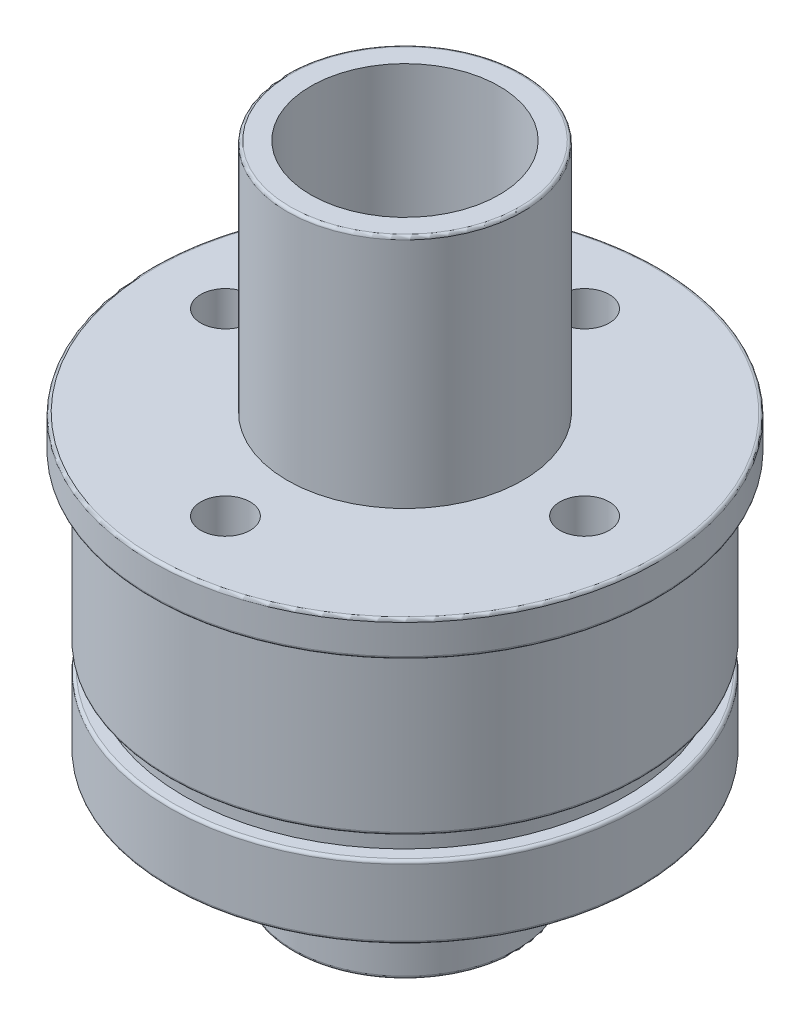
ISO-10303-21;
HEADER;
FILE_DESCRIPTION(('STEP AP214'),'2;1');
FILE_NAME('part.step','',(''),(''),'','','');
FILE_SCHEMA(('AUTOMOTIVE_DESIGN { 1 0 10303 214 1 1 1 1 }'));
ENDSEC;
DATA;
#1=APPLICATION_CONTEXT('core data for automotive mechanical design processes');
#2=APPLICATION_PROTOCOL_DEFINITION('international standard','automotive_design',2000,#1);
#3=PRODUCT_CONTEXT('',#1,'mechanical');
#4=PRODUCT('Part','Part','',(#3));
#5=PRODUCT_RELATED_PRODUCT_CATEGORY('part','',(#4));
#6=PRODUCT_DEFINITION_FORMATION('','',#4);
#7=PRODUCT_DEFINITION_CONTEXT('part definition',#1,'design');
#8=PRODUCT_DEFINITION('design','',#6,#7);
#9=PRODUCT_DEFINITION_SHAPE('','',#8);
#10=(LENGTH_UNIT() NAMED_UNIT(*) SI_UNIT(.MILLI.,.METRE.));
#11=(NAMED_UNIT(*) PLANE_ANGLE_UNIT() SI_UNIT($,.RADIAN.));
#12=(NAMED_UNIT(*) SI_UNIT($,.STERADIAN.) SOLID_ANGLE_UNIT());
#13=UNCERTAINTY_MEASURE_WITH_UNIT(LENGTH_MEASURE(1.E-05),#10,'distance_accuracy_value','');
#14=(GEOMETRIC_REPRESENTATION_CONTEXT(3) GLOBAL_UNCERTAINTY_ASSIGNED_CONTEXT((#13)) GLOBAL_UNIT_ASSIGNED_CONTEXT((#10,
#11,#12)) REPRESENTATION_CONTEXT('',''));
#15=CARTESIAN_POINT('',(0.,0.,0.));
#16=DIRECTION('',(0.,0.,1.));
#17=DIRECTION('',(1.,0.,0.));
#18=AXIS2_PLACEMENT_3D('',#15,#16,#17);
#19=CARTESIAN_POINT('',(0.,29.,0.));
#20=DIRECTION('',(0.,1.,0.));
#21=DIRECTION('',(0.,0.,1.));
#22=AXIS2_PLACEMENT_3D('',#19,#20,#21);
#23=CYLINDRICAL_SURFACE('',#22,20.);
#24=CARTESIAN_POINT('',(0.,32.25,0.));
#25=DIRECTION('',(0.,-1.,0.));
#26=DIRECTION('',(0.,0.,-1.));
#27=AXIS2_PLACEMENT_3D('',#24,#25,#26);
#28=CIRCLE('',#27,20.);
#29=CARTESIAN_POINT('',(0.,32.25,-20.));
#30=VERTEX_POINT('',#29);
#31=EDGE_CURVE('E201',#30,#30,#28,.F.);
#32=ORIENTED_EDGE('',*,*,#31,.T.);
#33=EDGE_LOOP('',(#32));
#34=FACE_BOUND('',#33,.T.);
#35=CARTESIAN_POINT('',(0.,46.00000000001,0.));
#36=DIRECTION('',(0.,-1.,0.));
#37=DIRECTION('',(0.,0.,-1.));
#38=AXIS2_PLACEMENT_3D('',#35,#36,#37);
#39=CIRCLE('',#38,20.);
#40=CARTESIAN_POINT('',(0.,46.00000000001,-20.));
#41=VERTEX_POINT('',#40);
#42=EDGE_CURVE('E162',#41,#41,#39,.T.);
#43=ORIENTED_EDGE('',*,*,#42,.T.);
#44=EDGE_LOOP('',(#43));
#45=FACE_BOUND('',#44,.T.);
#46=ADVANCED_FACE('F49',(#34,#45),#23,.T.);
#47=CARTESIAN_POINT('',(0.,49.,0.));
#48=DIRECTION('',(0.,-1.,0.));
#49=DIRECTION('',(0.,0.,-1.));
#50=AXIS2_PLACEMENT_3D('',#47,#48,#49);
#51=CYLINDRICAL_SURFACE('',#50,21.5);
#52=CARTESIAN_POINT('',(0.,46.25000000001,0.));
#53=DIRECTION('',(0.,-1.,0.));
#54=DIRECTION('',(0.,0.,-1.));
#55=AXIS2_PLACEMENT_3D('',#52,#53,#54);
#56=CIRCLE('',#55,21.5);
#57=CARTESIAN_POINT('',(0.,46.25000000001,-21.5));
#58=VERTEX_POINT('',#57);
#59=EDGE_CURVE('E180',#58,#58,#56,.F.);
#60=ORIENTED_EDGE('',*,*,#59,.T.);
#61=EDGE_LOOP('',(#60));
#62=FACE_BOUND('',#61,.T.);
#63=CARTESIAN_POINT('',(0.,48.75,0.));
#64=DIRECTION('',(0.,1.,0.));
#65=DIRECTION('',(0.,0.,1.));
#66=AXIS2_PLACEMENT_3D('',#63,#64,#65);
#67=CIRCLE('',#66,21.5);
#68=CARTESIAN_POINT('',(0.,48.75,21.5));
#69=VERTEX_POINT('',#68);
#70=EDGE_CURVE('E177',#69,#69,#67,.F.);
#71=ORIENTED_EDGE('',*,*,#70,.T.);
#72=EDGE_LOOP('',(#71));
#73=FACE_BOUND('',#72,.T.);
#74=ADVANCED_FACE('F224',(#62,#73),#51,.T.);
#75=CARTESIAN_POINT('',(21.5,49.,0.));
#76=DIRECTION('',(0.,1.,0.));
#77=DIRECTION('',(0.,0.,1.));
#78=AXIS2_PLACEMENT_3D('',#75,#76,#77);
#79=PLANE('',#78);
#80=CARTESIAN_POINT('',(0.,49.,-15.25));
#81=DIRECTION('',(0.,1.,0.));
#82=DIRECTION('',(0.,0.,1.));
#83=AXIS2_PLACEMENT_3D('',#80,#81,#82);
#84=CIRCLE('',#83,2.1);
#85=CARTESIAN_POINT('',(0.,49.,-13.15));
#86=VERTEX_POINT('',#85);
#87=EDGE_CURVE('E93',#86,#86,#84,.T.);
#88=ORIENTED_EDGE('',*,*,#87,.F.);
#89=EDGE_LOOP('',(#88));
#90=FACE_BOUND('',#89,.T.);
#91=CARTESIAN_POINT('',(15.25,49.,0.));
#92=DIRECTION('',(0.,1.,0.));
#93=DIRECTION('',(0.,0.,1.));
#94=AXIS2_PLACEMENT_3D('',#91,#92,#93);
#95=CIRCLE('',#94,2.1);
#96=CARTESIAN_POINT('',(15.25,49.,2.1));
#97=VERTEX_POINT('',#96);
#98=EDGE_CURVE('E92',#97,#97,#95,.T.);
#99=ORIENTED_EDGE('',*,*,#98,.F.);
#100=EDGE_LOOP('',(#99));
#101=FACE_BOUND('',#100,.T.);
#102=CARTESIAN_POINT('',(0.,49.,15.25));
#103=DIRECTION('',(0.,1.,0.));
#104=DIRECTION('',(0.,0.,1.));
#105=AXIS2_PLACEMENT_3D('',#102,#103,#104);
#106=CIRCLE('',#105,2.1);
#107=CARTESIAN_POINT('',(0.,49.,17.35));
#108=VERTEX_POINT('',#107);
#109=EDGE_CURVE('E105',#108,#108,#106,.T.);
#110=ORIENTED_EDGE('',*,*,#109,.F.);
#111=EDGE_LOOP('',(#110));
#112=FACE_BOUND('',#111,.T.);
#113=CARTESIAN_POINT('',(-15.25,49.,0.));
#114=DIRECTION('',(0.,1.,0.));
#115=DIRECTION('',(0.,0.,1.));
#116=AXIS2_PLACEMENT_3D('',#113,#114,#115);
#117=CIRCLE('',#116,2.1);
#118=CARTESIAN_POINT('',(-15.25,49.,2.1));
#119=VERTEX_POINT('',#118);
#120=EDGE_CURVE('E111',#119,#119,#117,.T.);
#121=ORIENTED_EDGE('',*,*,#120,.F.);
#122=EDGE_LOOP('',(#121));
#123=FACE_BOUND('',#122,.T.);
#124=CARTESIAN_POINT('',(0.,49.,0.));
#125=DIRECTION('',(0.,1.,0.));
#126=DIRECTION('',(0.,0.,1.));
#127=AXIS2_PLACEMENT_3D('',#124,#125,#126);
#128=CIRCLE('',#127,21.25);
#129=CARTESIAN_POINT('',(0.,49.,21.25));
#130=VERTEX_POINT('',#129);
#131=EDGE_CURVE('E183',#130,#130,#128,.T.);
#132=ORIENTED_EDGE('',*,*,#131,.T.);
#133=EDGE_LOOP('',(#132));
#134=FACE_BOUND('',#133,.T.);
#135=CARTESIAN_POINT('',(0.,49.,0.));
#136=DIRECTION('',(0.,1.,0.));
#137=DIRECTION('',(0.,0.,1.));
#138=AXIS2_PLACEMENT_3D('',#135,#136,#137);
#139=CIRCLE('',#138,10.);
#140=CARTESIAN_POINT('',(0.,49.,10.));
#141=VERTEX_POINT('',#140);
#142=EDGE_CURVE('E163',#141,#141,#139,.T.);
#143=ORIENTED_EDGE('',*,*,#142,.F.);
#144=EDGE_LOOP('',(#143));
#145=FACE_BOUND('',#144,.T.);
#146=ADVANCED_FACE('F232',(#90,#101,#112,#123,#134,#145),#79,.T.);
#147=CARTESIAN_POINT('',(0.,46.00000000001,0.));
#148=DIRECTION('',(0.,-1.,0.));
#149=DIRECTION('',(0.,0.,-1.));
#150=AXIS2_PLACEMENT_3D('',#147,#148,#149);
#151=PLANE('',#150);
#152=CARTESIAN_POINT('',(0.,46.00000000001,0.));
#153=DIRECTION('',(0.,-1.,0.));
#154=DIRECTION('',(0.,0.,-1.));
#155=AXIS2_PLACEMENT_3D('',#152,#153,#154);
#156=CIRCLE('',#155,21.25);
#157=CARTESIAN_POINT('',(0.,46.00000000001,-21.25));
#158=VERTEX_POINT('',#157);
#159=EDGE_CURVE('E174',#158,#158,#156,.T.);
#160=ORIENTED_EDGE('',*,*,#159,.T.);
#161=EDGE_LOOP('',(#160));
#162=FACE_BOUND('',#161,.T.);
#163=ORIENTED_EDGE('',*,*,#42,.F.);
#164=EDGE_LOOP('',(#163));
#165=FACE_BOUND('',#164,.T.);
#166=ADVANCED_FACE('F291',(#162,#165),#151,.T.);
#167=CARTESIAN_POINT('',(0.,69.,0.));
#168=DIRECTION('',(0.,-1.,0.));
#169=DIRECTION('',(0.,0.,-1.));
#170=AXIS2_PLACEMENT_3D('',#167,#168,#169);
#171=CYLINDRICAL_SURFACE('',#170,10.);
#172=CARTESIAN_POINT('',(0.,68.75,0.));
#173=DIRECTION('',(0.,1.,0.));
#174=DIRECTION('',(0.,0.,1.));
#175=AXIS2_PLACEMENT_3D('',#172,#173,#174);
#176=CIRCLE('',#175,10.);
#177=CARTESIAN_POINT('',(0.,68.75,10.));
#178=VERTEX_POINT('',#177);
#179=EDGE_CURVE('E189',#178,#178,#176,.F.);
#180=ORIENTED_EDGE('',*,*,#179,.T.);
#181=EDGE_LOOP('',(#180));
#182=FACE_BOUND('',#181,.T.);
#183=ORIENTED_EDGE('',*,*,#142,.T.);
#184=EDGE_LOOP('',(#183));
#185=FACE_BOUND('',#184,.T.);
#186=ADVANCED_FACE('F284',(#182,#185),#171,.T.);
#187=CARTESIAN_POINT('',(0.,69.,0.));
#188=DIRECTION('',(0.,1.,0.));
#189=DIRECTION('',(0.,0.,1.));
#190=AXIS2_PLACEMENT_3D('',#187,#188,#189);
#191=PLANE('',#190);
#192=CARTESIAN_POINT('',(0.,69.,0.));
#193=DIRECTION('',(0.,1.,0.));
#194=DIRECTION('',(0.,0.,1.));
#195=AXIS2_PLACEMENT_3D('',#192,#193,#194);
#196=CIRCLE('',#195,8.);
#197=CARTESIAN_POINT('',(0.,69.,8.));
#198=VERTEX_POINT('',#197);
#199=EDGE_CURVE('E99',#198,#198,#196,.T.);
#200=ORIENTED_EDGE('',*,*,#199,.F.);
#201=EDGE_LOOP('',(#200));
#202=FACE_BOUND('',#201,.T.);
#203=CARTESIAN_POINT('',(0.,69.,0.));
#204=DIRECTION('',(0.,1.,0.));
#205=DIRECTION('',(0.,0.,1.));
#206=AXIS2_PLACEMENT_3D('',#203,#204,#205);
#207=CIRCLE('',#206,9.75);
#208=CARTESIAN_POINT('',(0.,69.,9.75));
#209=VERTEX_POINT('',#208);
#210=EDGE_CURVE('E186',#209,#209,#207,.T.);
#211=ORIENTED_EDGE('',*,*,#210,.T.);
#212=EDGE_LOOP('',(#211));
#213=FACE_BOUND('',#212,.T.);
#214=ADVANCED_FACE('F265',(#202,#213),#191,.T.);
#215=CARTESIAN_POINT('',(0.,46.25000000001,0.));
#216=DIRECTION('',(0.,-1.,0.));
#217=DIRECTION('',(0.,0.,-1.));
#218=AXIS2_PLACEMENT_3D('',#215,#216,#217);
#219=TOROIDAL_SURFACE('',#218,21.25,0.25);
#220=ORIENTED_EDGE('',*,*,#59,.F.);
#221=EDGE_LOOP('',(#220));
#222=FACE_BOUND('',#221,.T.);
#223=ORIENTED_EDGE('',*,*,#159,.F.);
#224=EDGE_LOOP('',(#223));
#225=FACE_BOUND('',#224,.T.);
#226=ADVANCED_FACE('F262',(#222,#225),#219,.T.);
#227=CARTESIAN_POINT('',(0.,48.75,0.));
#228=DIRECTION('',(0.,1.,0.));
#229=DIRECTION('',(0.,0.,1.));
#230=AXIS2_PLACEMENT_3D('',#227,#228,#229);
#231=TOROIDAL_SURFACE('',#230,21.25,0.25);
#232=ORIENTED_EDGE('',*,*,#131,.F.);
#233=EDGE_LOOP('',(#232));
#234=FACE_BOUND('',#233,.T.);
#235=ORIENTED_EDGE('',*,*,#70,.F.);
#236=EDGE_LOOP('',(#235));
#237=FACE_BOUND('',#236,.T.);
#238=ADVANCED_FACE('F264',(#234,#237),#231,.T.);
#239=CARTESIAN_POINT('',(0.,68.75,0.));
#240=DIRECTION('',(0.,1.,0.));
#241=DIRECTION('',(0.,0.,1.));
#242=AXIS2_PLACEMENT_3D('',#239,#240,#241);
#243=TOROIDAL_SURFACE('',#242,9.75,0.25);
#244=ORIENTED_EDGE('',*,*,#179,.F.);
#245=EDGE_LOOP('',(#244));
#246=FACE_BOUND('',#245,.T.);
#247=ORIENTED_EDGE('',*,*,#210,.F.);
#248=EDGE_LOOP('',(#247));
#249=FACE_BOUND('',#248,.T.);
#250=ADVANCED_FACE('F269',(#246,#249),#243,.T.);
#251=CARTESIAN_POINT('',(0.,30.15,0.));
#252=DIRECTION('',(0.,-1.,0.));
#253=DIRECTION('',(0.,0.,-1.));
#254=AXIS2_PLACEMENT_3D('',#251,#252,#253);
#255=PLANE('',#254);
#256=CARTESIAN_POINT('',(0.,30.15,0.));
#257=DIRECTION('',(0.,-1.,0.));
#258=DIRECTION('',(0.,0.,-1.));
#259=AXIS2_PLACEMENT_3D('',#256,#257,#258);
#260=CIRCLE('',#259,19.75);
#261=CARTESIAN_POINT('',(0.,30.15,-19.75));
#262=VERTEX_POINT('',#261);
#263=EDGE_CURVE('E12',#262,#262,#260,.F.);
#264=ORIENTED_EDGE('',*,*,#263,.T.);
#265=EDGE_LOOP('',(#264));
#266=FACE_BOUND('',#265,.T.);
#267=CARTESIAN_POINT('',(0.,30.15,0.));
#268=DIRECTION('',(0.,-1.,0.));
#269=DIRECTION('',(0.,0.,-1.));
#270=AXIS2_PLACEMENT_3D('',#267,#268,#269);
#271=CIRCLE('',#270,18.75);
#272=CARTESIAN_POINT('',(0.,30.15,-18.75));
#273=VERTEX_POINT('',#272);
#274=EDGE_CURVE('E154',#273,#273,#271,.T.);
#275=ORIENTED_EDGE('',*,*,#274,.T.);
#276=EDGE_LOOP('',(#275));
#277=FACE_BOUND('',#276,.T.);
#278=ADVANCED_FACE('F272',(#266,#277),#255,.F.);
#279=CARTESIAN_POINT('',(0.,32.,0.));
#280=DIRECTION('',(0.,-1.,0.));
#281=DIRECTION('',(0.,0.,-1.));
#282=AXIS2_PLACEMENT_3D('',#279,#280,#281);
#283=PLANE('',#282);
#284=CARTESIAN_POINT('',(0.,32.,0.));
#285=DIRECTION('',(0.,-1.,0.));
#286=DIRECTION('',(0.,0.,-1.));
#287=AXIS2_PLACEMENT_3D('',#284,#285,#286);
#288=CIRCLE('',#287,19.75);
#289=CARTESIAN_POINT('',(0.,32.,-19.75));
#290=VERTEX_POINT('',#289);
#291=EDGE_CURVE('E198',#290,#290,#288,.T.);
#292=ORIENTED_EDGE('',*,*,#291,.T.);
#293=EDGE_LOOP('',(#292));
#294=FACE_BOUND('',#293,.T.);
#295=CARTESIAN_POINT('',(0.,32.,0.));
#296=DIRECTION('',(0.,-1.,0.));
#297=DIRECTION('',(0.,0.,-1.));
#298=AXIS2_PLACEMENT_3D('',#295,#296,#297);
#299=CIRCLE('',#298,18.75);
#300=CARTESIAN_POINT('',(0.,32.,-18.75));
#301=VERTEX_POINT('',#300);
#302=EDGE_CURVE('E153',#301,#301,#299,.T.);
#303=ORIENTED_EDGE('',*,*,#302,.F.);
#304=EDGE_LOOP('',(#303));
#305=FACE_BOUND('',#304,.T.);
#306=ADVANCED_FACE('F276',(#294,#305),#283,.T.);
#307=CARTESIAN_POINT('',(0.,30.15,0.));
#308=DIRECTION('',(0.,1.,0.));
#309=DIRECTION('',(0.,0.,1.));
#310=AXIS2_PLACEMENT_3D('',#307,#308,#309);
#311=CYLINDRICAL_SURFACE('',#310,18.75);
#312=ORIENTED_EDGE('',*,*,#274,.F.);
#313=EDGE_LOOP('',(#312));
#314=FACE_BOUND('',#313,.T.);
#315=ORIENTED_EDGE('',*,*,#302,.T.);
#316=EDGE_LOOP('',(#315));
#317=FACE_BOUND('',#316,.T.);
#318=ADVANCED_FACE('F298',(#314,#317),#311,.T.);
#319=CARTESIAN_POINT('',(0.,14.,0.));
#320=DIRECTION('',(0.,-1.,0.));
#321=DIRECTION('',(0.,0.,-1.));
#322=AXIS2_PLACEMENT_3D('',#319,#320,#321);
#323=PLANE('',#322);
#324=CARTESIAN_POINT('',(0.,14.,0.));
#325=DIRECTION('',(0.,1.,0.));
#326=DIRECTION('',(0.,0.,1.));
#327=AXIS2_PLACEMENT_3D('',#324,#325,#326);
#328=CIRCLE('',#327,8.);
#329=CARTESIAN_POINT('',(0.,14.,8.));
#330=VERTEX_POINT('',#329);
#331=EDGE_CURVE('E779',#330,#330,#328,.T.);
#332=ORIENTED_EDGE('',*,*,#331,.T.);
#333=EDGE_LOOP('',(#332));
#334=FACE_BOUND('',#333,.T.);
#335=CARTESIAN_POINT('',(0.,14.,0.));
#336=DIRECTION('',(0.,-1.,0.));
#337=DIRECTION('',(0.,0.,-1.));
#338=AXIS2_PLACEMENT_3D('',#335,#336,#337);
#339=CIRCLE('',#338,9.25);
#340=CARTESIAN_POINT('',(0.,14.,-9.25));
#341=VERTEX_POINT('',#340);
#342=EDGE_CURVE('E192',#341,#341,#339,.T.);
#343=ORIENTED_EDGE('',*,*,#342,.T.);
#344=EDGE_LOOP('',(#343));
#345=FACE_BOUND('',#344,.T.);
#346=ADVANCED_FACE('F297',(#334,#345),#323,.T.);
#347=CARTESIAN_POINT('',(0.,14.,0.));
#348=DIRECTION('',(0.,1.,0.));
#349=DIRECTION('',(0.,0.,1.));
#350=AXIS2_PLACEMENT_3D('',#347,#348,#349);
#351=CYLINDRICAL_SURFACE('',#350,9.5);
#352=CARTESIAN_POINT('',(0.,14.25,0.));
#353=DIRECTION('',(0.,-1.,0.));
#354=DIRECTION('',(0.,0.,-1.));
#355=AXIS2_PLACEMENT_3D('',#352,#353,#354);
#356=CIRCLE('',#355,9.5);
#357=CARTESIAN_POINT('',(0.,14.25,-9.5));
#358=VERTEX_POINT('',#357);
#359=EDGE_CURVE('E195',#358,#358,#356,.F.);
#360=ORIENTED_EDGE('',*,*,#359,.T.);
#361=EDGE_LOOP('',(#360));
#362=FACE_BOUND('',#361,.T.);
#363=CARTESIAN_POINT('',(0.,24.,0.));
#364=DIRECTION('',(0.,-1.,0.));
#365=DIRECTION('',(0.,0.,-1.));
#366=AXIS2_PLACEMENT_3D('',#363,#364,#365);
#367=CIRCLE('',#366,9.5);
#368=CARTESIAN_POINT('',(0.,24.,-9.5));
#369=VERTEX_POINT('',#368);
#370=EDGE_CURVE('E157',#369,#369,#367,.T.);
#371=ORIENTED_EDGE('',*,*,#370,.T.);
#372=EDGE_LOOP('',(#371));
#373=FACE_BOUND('',#372,.T.);
#374=ADVANCED_FACE('F255',(#362,#373),#351,.T.);
#375=CARTESIAN_POINT('',(0.,24.,0.));
#376=DIRECTION('',(0.,-1.,0.));
#377=DIRECTION('',(0.,0.,-1.));
#378=AXIS2_PLACEMENT_3D('',#375,#376,#377);
#379=PLANE('',#378);
#380=CARTESIAN_POINT('',(10.5,24.,10.5));
#381=DIRECTION('',(0.,-1.,0.));
#382=DIRECTION('',(0.,0.,-1.));
#383=AXIS2_PLACEMENT_3D('',#380,#381,#382);
#384=CIRCLE('',#383,2.525);
#385=CARTESIAN_POINT('',(10.5,24.,7.97500000000001));
#386=VERTEX_POINT('',#385);
#387=EDGE_CURVE('E117',#386,#386,#384,.T.);
#388=ORIENTED_EDGE('',*,*,#387,.F.);
#389=EDGE_LOOP('',(#388));
#390=FACE_BOUND('',#389,.T.);
#391=CARTESIAN_POINT('',(-10.5,24.,-10.5));
#392=DIRECTION('',(0.,-1.,0.));
#393=DIRECTION('',(0.,0.,-1.));
#394=AXIS2_PLACEMENT_3D('',#391,#392,#393);
#395=CIRCLE('',#394,2.525);
#396=CARTESIAN_POINT('',(-10.5,24.,-13.025));
#397=VERTEX_POINT('',#396);
#398=EDGE_CURVE('E126',#397,#397,#395,.T.);
#399=ORIENTED_EDGE('',*,*,#398,.F.);
#400=EDGE_LOOP('',(#399));
#401=FACE_BOUND('',#400,.T.);
#402=CARTESIAN_POINT('',(-10.5,24.,10.5));
#403=DIRECTION('',(0.,-1.,0.));
#404=DIRECTION('',(0.,0.,-1.));
#405=AXIS2_PLACEMENT_3D('',#402,#403,#404);
#406=CIRCLE('',#405,2.525);
#407=CARTESIAN_POINT('',(-10.5,24.,7.975));
#408=VERTEX_POINT('',#407);
#409=EDGE_CURVE('E135',#408,#408,#406,.T.);
#410=ORIENTED_EDGE('',*,*,#409,.F.);
#411=EDGE_LOOP('',(#410));
#412=FACE_BOUND('',#411,.T.);
#413=CARTESIAN_POINT('',(10.5,24.,-10.5));
#414=DIRECTION('',(0.,-1.,0.));
#415=DIRECTION('',(0.,0.,-1.));
#416=AXIS2_PLACEMENT_3D('',#413,#414,#415);
#417=CIRCLE('',#416,2.525);
#418=CARTESIAN_POINT('',(10.5,24.,-13.025));
#419=VERTEX_POINT('',#418);
#420=EDGE_CURVE('E144',#419,#419,#417,.T.);
#421=ORIENTED_EDGE('',*,*,#420,.F.);
#422=EDGE_LOOP('',(#421));
#423=FACE_BOUND('',#422,.T.);
#424=CARTESIAN_POINT('',(0.,24.,0.));
#425=DIRECTION('',(0.,-1.,0.));
#426=DIRECTION('',(0.,0.,-1.));
#427=AXIS2_PLACEMENT_3D('',#424,#425,#426);
#428=CIRCLE('',#427,19.75);
#429=CARTESIAN_POINT('',(0.,24.,-19.75));
#430=VERTEX_POINT('',#429);
#431=EDGE_CURVE('E166',#430,#430,#428,.T.);
#432=ORIENTED_EDGE('',*,*,#431,.T.);
#433=EDGE_LOOP('',(#432));
#434=FACE_BOUND('',#433,.T.);
#435=ORIENTED_EDGE('',*,*,#370,.F.);
#436=EDGE_LOOP('',(#435));
#437=FACE_BOUND('',#436,.T.);
#438=ADVANCED_FACE('F247',(#390,#401,#412,#423,#434,#437),#379,.T.);
#439=CARTESIAN_POINT('',(0.,24.25,0.));
#440=DIRECTION('',(0.,-1.,0.));
#441=DIRECTION('',(0.,0.,-1.));
#442=AXIS2_PLACEMENT_3D('',#439,#440,#441);
#443=TOROIDAL_SURFACE('',#442,19.75,0.25);
#444=CARTESIAN_POINT('',(0.,24.25,0.));
#445=DIRECTION('',(0.,-1.,0.));
#446=DIRECTION('',(0.,0.,-1.));
#447=AXIS2_PLACEMENT_3D('',#444,#445,#446);
#448=CIRCLE('',#447,20.);
#449=CARTESIAN_POINT('',(0.,24.25,-20.));
#450=VERTEX_POINT('',#449);
#451=EDGE_CURVE('E171',#450,#450,#448,.F.);
#452=ORIENTED_EDGE('',*,*,#451,.F.);
#453=EDGE_LOOP('',(#452));
#454=FACE_BOUND('',#453,.T.);
#455=ORIENTED_EDGE('',*,*,#431,.F.);
#456=EDGE_LOOP('',(#455));
#457=FACE_BOUND('',#456,.T.);
#458=ADVANCED_FACE('F239',(#454,#457),#443,.T.);
#459=CARTESIAN_POINT('',(0.,29.9,0.));
#460=DIRECTION('',(0.,-1.,0.));
#461=DIRECTION('',(0.,0.,-1.));
#462=AXIS2_PLACEMENT_3D('',#459,#460,#461);
#463=CIRCLE('',#462,20.);
#464=CARTESIAN_POINT('',(0.,29.9,-20.));
#465=VERTEX_POINT('',#464);
#466=EDGE_CURVE('E57',#465,#465,#463,.T.);
#467=ORIENTED_EDGE('',*,*,#466,.T.);
#468=EDGE_LOOP('',(#467));
#469=FACE_BOUND('',#468,.T.);
#470=ORIENTED_EDGE('',*,*,#451,.T.);
#471=EDGE_LOOP('',(#470));
#472=FACE_BOUND('',#471,.T.);
#473=ADVANCED_FACE('F206',(#469,#472),#23,.T.);
#474=CARTESIAN_POINT('',(0.,14.25,0.));
#475=DIRECTION('',(0.,-1.,0.));
#476=DIRECTION('',(0.,0.,-1.));
#477=AXIS2_PLACEMENT_3D('',#474,#475,#476);
#478=TOROIDAL_SURFACE('',#477,9.25,0.25);
#479=ORIENTED_EDGE('',*,*,#359,.F.);
#480=EDGE_LOOP('',(#479));
#481=FACE_BOUND('',#480,.T.);
#482=ORIENTED_EDGE('',*,*,#342,.F.);
#483=EDGE_LOOP('',(#482));
#484=FACE_BOUND('',#483,.T.);
#485=ADVANCED_FACE('F220',(#481,#484),#478,.T.);
#486=CARTESIAN_POINT('',(0.,32.25,0.));
#487=DIRECTION('',(0.,-1.,0.));
#488=DIRECTION('',(0.,0.,-1.));
#489=AXIS2_PLACEMENT_3D('',#486,#487,#488);
#490=TOROIDAL_SURFACE('',#489,19.75,0.25);
#491=ORIENTED_EDGE('',*,*,#31,.F.);
#492=EDGE_LOOP('',(#491));
#493=FACE_BOUND('',#492,.T.);
#494=ORIENTED_EDGE('',*,*,#291,.F.);
#495=EDGE_LOOP('',(#494));
#496=FACE_BOUND('',#495,.T.);
#497=ADVANCED_FACE('F211',(#493,#496),#490,.T.);
#498=CARTESIAN_POINT('',(0.,29.9,0.));
#499=DIRECTION('',(0.,-1.,0.));
#500=DIRECTION('',(0.,0.,-1.));
#501=AXIS2_PLACEMENT_3D('',#498,#499,#500);
#502=TOROIDAL_SURFACE('',#501,19.75,0.25);
#503=ORIENTED_EDGE('',*,*,#263,.F.);
#504=EDGE_LOOP('',(#503));
#505=FACE_BOUND('',#504,.T.);
#506=ORIENTED_EDGE('',*,*,#466,.F.);
#507=EDGE_LOOP('',(#506));
#508=FACE_BOUND('',#507,.T.);
#509=ADVANCED_FACE('F51',(#505,#508),#502,.T.);
#510=CARTESIAN_POINT('',(10.5,36.4,-10.5));
#511=DIRECTION('',(0.,-1.,0.));
#512=DIRECTION('',(0.,0.,-1.));
#513=AXIS2_PLACEMENT_3D('',#510,#511,#512);
#514=CONICAL_SURFACE('',#513,2.1,1.02974425867665);
#515=CARTESIAN_POINT('',(10.5,37.6618072999579,-10.5));
#516=VERTEX_POINT('',#515);
#517=VERTEX_LOOP('',#516);
#518=FACE_BOUND('',#517,.T.);
#519=CARTESIAN_POINT('',(10.5,36.4,-10.5));
#520=DIRECTION('',(0.,-1.,0.));
#521=DIRECTION('',(0.,0.,-1.));
#522=AXIS2_PLACEMENT_3D('',#519,#520,#521);
#523=CIRCLE('',#522,2.1);
#524=CARTESIAN_POINT('',(10.5,36.4,-12.6));
#525=VERTEX_POINT('',#524);
#526=EDGE_CURVE('E150',#525,#525,#523,.T.);
#527=ORIENTED_EDGE('',*,*,#526,.T.);
#528=EDGE_LOOP('',(#527));
#529=FACE_BOUND('',#528,.T.);
#530=ADVANCED_FACE('F210',(#518,#529),#514,.F.);
#531=CARTESIAN_POINT('',(10.5,24.,-10.5));
#532=DIRECTION('',(0.,-1.,0.));
#533=DIRECTION('',(0.,0.,-1.));
#534=AXIS2_PLACEMENT_3D('',#531,#532,#533);
#535=CYLINDRICAL_SURFACE('',#534,2.1);
#536=ORIENTED_EDGE('',*,*,#526,.F.);
#537=EDGE_LOOP('',(#536));
#538=FACE_BOUND('',#537,.T.);
#539=CARTESIAN_POINT('',(10.5,24.425,-10.5));
#540=DIRECTION('',(0.,-1.,0.));
#541=DIRECTION('',(0.,0.,-1.));
#542=AXIS2_PLACEMENT_3D('',#539,#540,#541);
#543=CIRCLE('',#542,2.1);
#544=CARTESIAN_POINT('',(10.5,24.425,-12.6));
#545=VERTEX_POINT('',#544);
#546=EDGE_CURVE('E147',#545,#545,#543,.T.);
#547=ORIENTED_EDGE('',*,*,#546,.T.);
#548=EDGE_LOOP('',(#547));
#549=FACE_BOUND('',#548,.T.);
#550=ADVANCED_FACE('F218',(#538,#549),#535,.F.);
#551=CARTESIAN_POINT('',(10.5,24.,-10.5));
#552=DIRECTION('',(0.,-1.,0.));
#553=DIRECTION('',(0.,0.,-1.));
#554=AXIS2_PLACEMENT_3D('',#551,#552,#553);
#555=CONICAL_SURFACE('',#554,2.525,0.785398163397448);
#556=ORIENTED_EDGE('',*,*,#546,.F.);
#557=EDGE_LOOP('',(#556));
#558=FACE_BOUND('',#557,.T.);
#559=ORIENTED_EDGE('',*,*,#420,.T.);
#560=EDGE_LOOP('',(#559));
#561=FACE_BOUND('',#560,.T.);
#562=ADVANCED_FACE('F569',(#558,#561),#555,.F.);
#563=CARTESIAN_POINT('',(-10.5,36.4,10.5));
#564=DIRECTION('',(0.,-1.,0.));
#565=DIRECTION('',(0.,0.,-1.));
#566=AXIS2_PLACEMENT_3D('',#563,#564,#565);
#567=CONICAL_SURFACE('',#566,2.1,1.02974425867665);
#568=CARTESIAN_POINT('',(-10.5,37.6618072999579,10.5));
#569=VERTEX_POINT('',#568);
#570=VERTEX_LOOP('',#569);
#571=FACE_BOUND('',#570,.T.);
#572=CARTESIAN_POINT('',(-10.5,36.4,10.5));
#573=DIRECTION('',(0.,-1.,0.));
#574=DIRECTION('',(0.,0.,-1.));
#575=AXIS2_PLACEMENT_3D('',#572,#573,#574);
#576=CIRCLE('',#575,2.1);
#577=CARTESIAN_POINT('',(-10.5,36.4,8.40000000000001));
#578=VERTEX_POINT('',#577);
#579=EDGE_CURVE('E141',#578,#578,#576,.T.);
#580=ORIENTED_EDGE('',*,*,#579,.T.);
#581=EDGE_LOOP('',(#580));
#582=FACE_BOUND('',#581,.T.);
#583=ADVANCED_FACE('F558',(#571,#582),#567,.F.);
#584=CARTESIAN_POINT('',(-10.5,24.,10.5));
#585=DIRECTION('',(0.,-1.,0.));
#586=DIRECTION('',(0.,0.,-1.));
#587=AXIS2_PLACEMENT_3D('',#584,#585,#586);
#588=CYLINDRICAL_SURFACE('',#587,2.1);
#589=ORIENTED_EDGE('',*,*,#579,.F.);
#590=EDGE_LOOP('',(#589));
#591=FACE_BOUND('',#590,.T.);
#592=CARTESIAN_POINT('',(-10.5,24.425,10.5));
#593=DIRECTION('',(0.,-1.,0.));
#594=DIRECTION('',(0.,0.,-1.));
#595=AXIS2_PLACEMENT_3D('',#592,#593,#594);
#596=CIRCLE('',#595,2.1);
#597=CARTESIAN_POINT('',(-10.5,24.425,8.4));
#598=VERTEX_POINT('',#597);
#599=EDGE_CURVE('E138',#598,#598,#596,.T.);
#600=ORIENTED_EDGE('',*,*,#599,.T.);
#601=EDGE_LOOP('',(#600));
#602=FACE_BOUND('',#601,.T.);
#603=ADVANCED_FACE('F547',(#591,#602),#588,.F.);
#604=CARTESIAN_POINT('',(-10.5,24.,10.5));
#605=DIRECTION('',(0.,-1.,0.));
#606=DIRECTION('',(0.,0.,-1.));
#607=AXIS2_PLACEMENT_3D('',#604,#605,#606);
#608=CONICAL_SURFACE('',#607,2.525,0.785398163397446);
#609=ORIENTED_EDGE('',*,*,#599,.F.);
#610=EDGE_LOOP('',(#609));
#611=FACE_BOUND('',#610,.T.);
#612=ORIENTED_EDGE('',*,*,#409,.T.);
#613=EDGE_LOOP('',(#612));
#614=FACE_BOUND('',#613,.T.);
#615=ADVANCED_FACE('F536',(#611,#614),#608,.F.);
#616=CARTESIAN_POINT('',(-10.5,36.4,-10.5));
#617=DIRECTION('',(0.,-1.,0.));
#618=DIRECTION('',(0.,0.,-1.));
#619=AXIS2_PLACEMENT_3D('',#616,#617,#618);
#620=CONICAL_SURFACE('',#619,2.1,1.02974425867665);
#621=CARTESIAN_POINT('',(-10.5,37.6618072999579,-10.5));
#622=VERTEX_POINT('',#621);
#623=VERTEX_LOOP('',#622);
#624=FACE_BOUND('',#623,.T.);
#625=CARTESIAN_POINT('',(-10.5,36.4,-10.5));
#626=DIRECTION('',(0.,-1.,0.));
#627=DIRECTION('',(0.,0.,-1.));
#628=AXIS2_PLACEMENT_3D('',#625,#626,#627);
#629=CIRCLE('',#628,2.1);
#630=CARTESIAN_POINT('',(-10.5,36.4,-12.6));
#631=VERTEX_POINT('',#630);
#632=EDGE_CURVE('E132',#631,#631,#629,.T.);
#633=ORIENTED_EDGE('',*,*,#632,.T.);
#634=EDGE_LOOP('',(#633));
#635=FACE_BOUND('',#634,.T.);
#636=ADVANCED_FACE('F525',(#624,#635),#620,.F.);
#637=CARTESIAN_POINT('',(-10.5,24.,-10.5));
#638=DIRECTION('',(0.,-1.,0.));
#639=DIRECTION('',(0.,0.,-1.));
#640=AXIS2_PLACEMENT_3D('',#637,#638,#639);
#641=CYLINDRICAL_SURFACE('',#640,2.1);
#642=ORIENTED_EDGE('',*,*,#632,.F.);
#643=EDGE_LOOP('',(#642));
#644=FACE_BOUND('',#643,.T.);
#645=CARTESIAN_POINT('',(-10.5,24.425,-10.5));
#646=DIRECTION('',(0.,-1.,0.));
#647=DIRECTION('',(0.,0.,-1.));
#648=AXIS2_PLACEMENT_3D('',#645,#646,#647);
#649=CIRCLE('',#648,2.1);
#650=CARTESIAN_POINT('',(-10.5,24.425,-12.6));
#651=VERTEX_POINT('',#650);
#652=EDGE_CURVE('E129',#651,#651,#649,.T.);
#653=ORIENTED_EDGE('',*,*,#652,.T.);
#654=EDGE_LOOP('',(#653));
#655=FACE_BOUND('',#654,.T.);
#656=ADVANCED_FACE('F514',(#644,#655),#641,.F.);
#657=CARTESIAN_POINT('',(-10.5,24.,-10.5));
#658=DIRECTION('',(0.,-1.,0.));
#659=DIRECTION('',(0.,0.,-1.));
#660=AXIS2_PLACEMENT_3D('',#657,#658,#659);
#661=CONICAL_SURFACE('',#660,2.525,0.785398163397446);
#662=ORIENTED_EDGE('',*,*,#652,.F.);
#663=EDGE_LOOP('',(#662));
#664=FACE_BOUND('',#663,.T.);
#665=ORIENTED_EDGE('',*,*,#398,.T.);
#666=EDGE_LOOP('',(#665));
#667=FACE_BOUND('',#666,.T.);
#668=ADVANCED_FACE('F503',(#664,#667),#661,.F.);
#669=CARTESIAN_POINT('',(10.5,36.4,10.5));
#670=DIRECTION('',(0.,-1.,0.));
#671=DIRECTION('',(0.,0.,-1.));
#672=AXIS2_PLACEMENT_3D('',#669,#670,#671);
#673=CONICAL_SURFACE('',#672,2.1,1.02974425867665);
#674=CARTESIAN_POINT('',(10.5,37.6618072999579,10.5));
#675=VERTEX_POINT('',#674);
#676=VERTEX_LOOP('',#675);
#677=FACE_BOUND('',#676,.T.);
#678=CARTESIAN_POINT('',(10.5,36.4,10.5));
#679=DIRECTION('',(0.,-1.,0.));
#680=DIRECTION('',(0.,0.,-1.));
#681=AXIS2_PLACEMENT_3D('',#678,#679,#680);
#682=CIRCLE('',#681,2.1);
#683=CARTESIAN_POINT('',(10.5,36.4,8.40000000000001));
#684=VERTEX_POINT('',#683);
#685=EDGE_CURVE('E123',#684,#684,#682,.T.);
#686=ORIENTED_EDGE('',*,*,#685,.T.);
#687=EDGE_LOOP('',(#686));
#688=FACE_BOUND('',#687,.T.);
#689=ADVANCED_FACE('F492',(#677,#688),#673,.F.);
#690=CARTESIAN_POINT('',(10.5,24.,10.5));
#691=DIRECTION('',(0.,-1.,0.));
#692=DIRECTION('',(0.,0.,-1.));
#693=AXIS2_PLACEMENT_3D('',#690,#691,#692);
#694=CYLINDRICAL_SURFACE('',#693,2.1);
#695=ORIENTED_EDGE('',*,*,#685,.F.);
#696=EDGE_LOOP('',(#695));
#697=FACE_BOUND('',#696,.T.);
#698=CARTESIAN_POINT('',(10.5,24.425,10.5));
#699=DIRECTION('',(0.,-1.,0.));
#700=DIRECTION('',(0.,0.,-1.));
#701=AXIS2_PLACEMENT_3D('',#698,#699,#700);
#702=CIRCLE('',#701,2.1);
#703=CARTESIAN_POINT('',(10.5,24.425,8.40000000000001));
#704=VERTEX_POINT('',#703);
#705=EDGE_CURVE('E120',#704,#704,#702,.T.);
#706=ORIENTED_EDGE('',*,*,#705,.T.);
#707=EDGE_LOOP('',(#706));
#708=FACE_BOUND('',#707,.T.);
#709=ADVANCED_FACE('F481',(#697,#708),#694,.F.);
#710=CARTESIAN_POINT('',(10.5,24.,10.5));
#711=DIRECTION('',(0.,-1.,0.));
#712=DIRECTION('',(0.,0.,-1.));
#713=AXIS2_PLACEMENT_3D('',#710,#711,#712);
#714=CONICAL_SURFACE('',#713,2.525,0.785398163397446);
#715=ORIENTED_EDGE('',*,*,#705,.F.);
#716=EDGE_LOOP('',(#715));
#717=FACE_BOUND('',#716,.T.);
#718=ORIENTED_EDGE('',*,*,#387,.T.);
#719=EDGE_LOOP('',(#718));
#720=FACE_BOUND('',#719,.T.);
#721=ADVANCED_FACE('F469',(#717,#720),#714,.F.);
#722=CARTESIAN_POINT('',(-15.25,29.,0.));
#723=DIRECTION('',(0.,1.,0.));
#724=DIRECTION('',(0.,0.,1.));
#725=AXIS2_PLACEMENT_3D('',#722,#723,#724);
#726=CONICAL_SURFACE('',#725,2.09999999999999,1.02974425867665);
#727=CARTESIAN_POINT('',(-15.25,27.7381927000421,0.));
#728=VERTEX_POINT('',#727);
#729=VERTEX_LOOP('',#728);
#730=FACE_BOUND('',#729,.T.);
#731=CARTESIAN_POINT('',(-15.25,29.,0.));
#732=DIRECTION('',(0.,1.,0.));
#733=DIRECTION('',(0.,0.,1.));
#734=AXIS2_PLACEMENT_3D('',#731,#732,#733);
#735=CIRCLE('',#734,2.09999999999999);
#736=CARTESIAN_POINT('',(-15.25,29.,2.09999999999999));
#737=VERTEX_POINT('',#736);
#738=EDGE_CURVE('E114',#737,#737,#735,.T.);
#739=ORIENTED_EDGE('',*,*,#738,.T.);
#740=EDGE_LOOP('',(#739));
#741=FACE_BOUND('',#740,.T.);
#742=ADVANCED_FACE('F458',(#730,#741),#726,.F.);
#743=CARTESIAN_POINT('',(-15.25,49.,0.));
#744=DIRECTION('',(0.,1.,0.));
#745=DIRECTION('',(0.,0.,1.));
#746=AXIS2_PLACEMENT_3D('',#743,#744,#745);
#747=CYLINDRICAL_SURFACE('',#746,2.1);
#748=ORIENTED_EDGE('',*,*,#738,.F.);
#749=EDGE_LOOP('',(#748));
#750=FACE_BOUND('',#749,.T.);
#751=ORIENTED_EDGE('',*,*,#120,.T.);
#752=EDGE_LOOP('',(#751));
#753=FACE_BOUND('',#752,.T.);
#754=ADVANCED_FACE('F447',(#750,#753),#747,.F.);
#755=CARTESIAN_POINT('',(0.,29.,15.25));
#756=DIRECTION('',(0.,1.,0.));
#757=DIRECTION('',(0.,0.,1.));
#758=AXIS2_PLACEMENT_3D('',#755,#756,#757);
#759=CONICAL_SURFACE('',#758,2.1,1.02974425867665);
#760=CARTESIAN_POINT('',(0.,27.7381927000421,15.25));
#761=VERTEX_POINT('',#760);
#762=VERTEX_LOOP('',#761);
#763=FACE_BOUND('',#762,.T.);
#764=CARTESIAN_POINT('',(0.,29.,15.25));
#765=DIRECTION('',(0.,1.,0.));
#766=DIRECTION('',(0.,0.,1.));
#767=AXIS2_PLACEMENT_3D('',#764,#765,#766);
#768=CIRCLE('',#767,2.1);
#769=CARTESIAN_POINT('',(0.,29.,17.35));
#770=VERTEX_POINT('',#769);
#771=EDGE_CURVE('E108',#770,#770,#768,.T.);
#772=ORIENTED_EDGE('',*,*,#771,.T.);
#773=EDGE_LOOP('',(#772));
#774=FACE_BOUND('',#773,.T.);
#775=ADVANCED_FACE('F436',(#763,#774),#759,.F.);
#776=CARTESIAN_POINT('',(0.,49.,15.25));
#777=DIRECTION('',(0.,1.,0.));
#778=DIRECTION('',(0.,0.,1.));
#779=AXIS2_PLACEMENT_3D('',#776,#777,#778);
#780=CYLINDRICAL_SURFACE('',#779,2.1);
#781=ORIENTED_EDGE('',*,*,#771,.F.);
#782=EDGE_LOOP('',(#781));
#783=FACE_BOUND('',#782,.T.);
#784=ORIENTED_EDGE('',*,*,#109,.T.);
#785=EDGE_LOOP('',(#784));
#786=FACE_BOUND('',#785,.T.);
#787=ADVANCED_FACE('F425',(#783,#786),#780,.F.);
#788=CARTESIAN_POINT('',(15.25,29.,0.));
#789=DIRECTION('',(0.,1.,0.));
#790=DIRECTION('',(0.,0.,1.));
#791=AXIS2_PLACEMENT_3D('',#788,#789,#790);
#792=CONICAL_SURFACE('',#791,2.09999999999999,1.02974425867665);
#793=CARTESIAN_POINT('',(15.25,27.7381927000421,0.));
#794=VERTEX_POINT('',#793);
#795=VERTEX_LOOP('',#794);
#796=FACE_BOUND('',#795,.T.);
#797=CARTESIAN_POINT('',(15.25,29.,0.));
#798=DIRECTION('',(0.,1.,0.));
#799=DIRECTION('',(0.,0.,1.));
#800=AXIS2_PLACEMENT_3D('',#797,#798,#799);
#801=CIRCLE('',#800,2.09999999999999);
#802=CARTESIAN_POINT('',(15.25,29.,2.09999999999999));
#803=VERTEX_POINT('',#802);
#804=EDGE_CURVE('E96',#803,#803,#801,.T.);
#805=ORIENTED_EDGE('',*,*,#804,.T.);
#806=EDGE_LOOP('',(#805));
#807=FACE_BOUND('',#806,.T.);
#808=ADVANCED_FACE('F414',(#796,#807),#792,.F.);
#809=CARTESIAN_POINT('',(15.25,49.,0.));
#810=DIRECTION('',(0.,1.,0.));
#811=DIRECTION('',(0.,0.,1.));
#812=AXIS2_PLACEMENT_3D('',#809,#810,#811);
#813=CYLINDRICAL_SURFACE('',#812,2.1);
#814=ORIENTED_EDGE('',*,*,#804,.F.);
#815=EDGE_LOOP('',(#814));
#816=FACE_BOUND('',#815,.T.);
#817=ORIENTED_EDGE('',*,*,#98,.T.);
#818=EDGE_LOOP('',(#817));
#819=FACE_BOUND('',#818,.T.);
#820=ADVANCED_FACE('F86',(#816,#819),#813,.F.);
#821=CARTESIAN_POINT('',(0.,29.,-15.25));
#822=DIRECTION('',(0.,1.,0.));
#823=DIRECTION('',(0.,0.,1.));
#824=AXIS2_PLACEMENT_3D('',#821,#822,#823);
#825=CONICAL_SURFACE('',#824,2.1,1.02974425867665);
#826=CARTESIAN_POINT('',(0.,27.7381927000421,-15.25));
#827=VERTEX_POINT('',#826);
#828=VERTEX_LOOP('',#827);
#829=FACE_BOUND('',#828,.T.);
#830=CARTESIAN_POINT('',(0.,29.,-15.25));
#831=DIRECTION('',(0.,1.,0.));
#832=DIRECTION('',(0.,0.,1.));
#833=AXIS2_PLACEMENT_3D('',#830,#831,#832);
#834=CIRCLE('',#833,2.1);
#835=CARTESIAN_POINT('',(0.,29.,-13.15));
#836=VERTEX_POINT('',#835);
#837=EDGE_CURVE('E90',#836,#836,#834,.T.);
#838=ORIENTED_EDGE('',*,*,#837,.T.);
#839=EDGE_LOOP('',(#838));
#840=FACE_BOUND('',#839,.T.);
#841=ADVANCED_FACE('F82',(#829,#840),#825,.F.);
#842=CARTESIAN_POINT('',(0.,49.,-15.25));
#843=DIRECTION('',(0.,1.,0.));
#844=DIRECTION('',(0.,0.,1.));
#845=AXIS2_PLACEMENT_3D('',#842,#843,#844);
#846=CYLINDRICAL_SURFACE('',#845,2.1);
#847=ORIENTED_EDGE('',*,*,#837,.F.);
#848=EDGE_LOOP('',(#847));
#849=FACE_BOUND('',#848,.T.);
#850=ORIENTED_EDGE('',*,*,#87,.T.);
#851=EDGE_LOOP('',(#850));
#852=FACE_BOUND('',#851,.T.);
#853=ADVANCED_FACE('F85',(#849,#852),#846,.F.);
#854=CARTESIAN_POINT('',(0.,62.7654280389226,0.));
#855=DIRECTION('',(0.,1.,0.));
#856=DIRECTION('',(0.,0.,1.));
#857=AXIS2_PLACEMENT_3D('',#854,#855,#856);
#858=CYLINDRICAL_SURFACE('',#857,8.);
#859=ORIENTED_EDGE('',*,*,#199,.T.);
#860=EDGE_LOOP('',(#859));
#861=FACE_BOUND('',#860,.T.);
#862=ORIENTED_EDGE('',*,*,#331,.F.);
#863=EDGE_LOOP('',(#862));
#864=FACE_BOUND('',#863,.T.);
#865=ADVANCED_FACE('F380',(#861,#864),#858,.F.);
#866=CLOSED_SHELL('',(#46,#74,#146,#166,#186,#214,#226,#238,#250,#278,#306,#318,#346,#374,#438,
#458,#473,#485,#497,#509,#530,#550,#562,#583,#603,#615,#636,#656,#668,#689,#709,#721,#742,#754,
#775,#787,#808,#820,#841,#853,#865));
#867=MANIFOLD_SOLID_BREP('B2',#866);
#868=ADVANCED_BREP_SHAPE_REPRESENTATION('',(#18,#867),#14);
#869=SHAPE_DEFINITION_REPRESENTATION(#9,#868);
ENDSEC;
END-ISO-10303-21;
